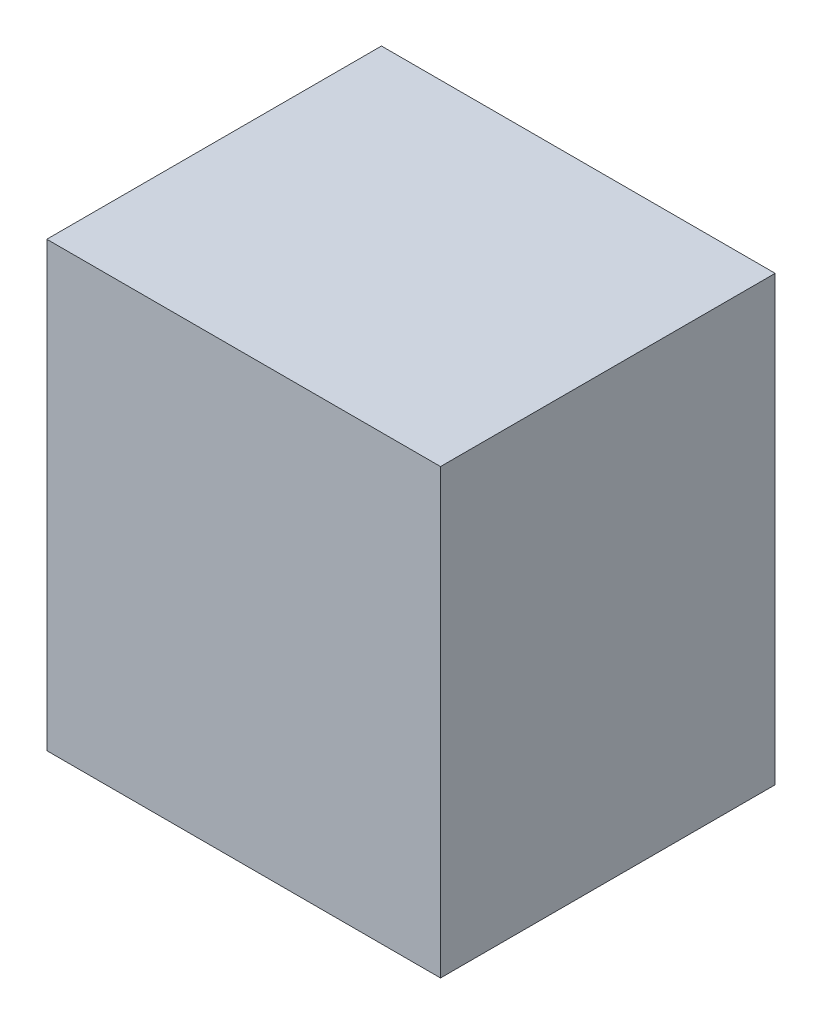
ISO-10303-21;
HEADER;
FILE_DESCRIPTION(('STEP AP214'),'2;1');
FILE_NAME('part.step','',(''),(''),'','','');
FILE_SCHEMA(('AUTOMOTIVE_DESIGN { 1 0 10303 214 1 1 1 1 }'));
ENDSEC;
DATA;
#1=APPLICATION_CONTEXT('core data for automotive mechanical design processes');
#2=APPLICATION_PROTOCOL_DEFINITION('international standard','automotive_design',2000,#1);
#3=PRODUCT_CONTEXT('',#1,'mechanical');
#4=PRODUCT('Part','Part','',(#3));
#5=PRODUCT_RELATED_PRODUCT_CATEGORY('part','',(#4));
#6=PRODUCT_DEFINITION_FORMATION('','',#4);
#7=PRODUCT_DEFINITION_CONTEXT('part definition',#1,'design');
#8=PRODUCT_DEFINITION('design','',#6,#7);
#9=PRODUCT_DEFINITION_SHAPE('','',#8);
#10=(LENGTH_UNIT() NAMED_UNIT(*) SI_UNIT(.MILLI.,.METRE.));
#11=(NAMED_UNIT(*) PLANE_ANGLE_UNIT() SI_UNIT($,.RADIAN.));
#12=(NAMED_UNIT(*) SI_UNIT($,.STERADIAN.) SOLID_ANGLE_UNIT());
#13=UNCERTAINTY_MEASURE_WITH_UNIT(LENGTH_MEASURE(1.E-05),#10,'distance_accuracy_value','');
#14=(GEOMETRIC_REPRESENTATION_CONTEXT(3) GLOBAL_UNCERTAINTY_ASSIGNED_CONTEXT((#13)) GLOBAL_UNIT_ASSIGNED_CONTEXT((#10,
#11,#12)) REPRESENTATION_CONTEXT('',''));
#15=CARTESIAN_POINT('',(0.,0.,0.));
#16=DIRECTION('',(0.,0.,1.));
#17=DIRECTION('',(1.,0.,0.));
#18=AXIS2_PLACEMENT_3D('',#15,#16,#17);
#19=CARTESIAN_POINT('',(40.,45.,68.));
#20=DIRECTION('',(-1.,0.,0.));
#21=DIRECTION('',(0.,-1.,0.));
#22=AXIS2_PLACEMENT_3D('',#19,#20,#21);
#23=PLANE('',#22);
#24=DIRECTION('',(0.,1.,0.));
#25=VECTOR('',#24,1.);
#26=CARTESIAN_POINT('',(40.,45.,0.));
#27=LINE('',#26,#25);
#28=CARTESIAN_POINT('',(40.,-45.,0.));
#29=VERTEX_POINT('',#28);
#30=CARTESIAN_POINT('',(40.,45.,0.));
#31=VERTEX_POINT('',#30);
#32=EDGE_CURVE('E107',#29,#31,#27,.T.);
#33=ORIENTED_EDGE('',*,*,#32,.T.);
#34=DIRECTION('',(0.,0.,-1.));
#35=VECTOR('',#34,1.);
#36=CARTESIAN_POINT('',(40.,45.,68.));
#37=LINE('',#36,#35);
#38=CARTESIAN_POINT('',(40.,45.,68.));
#39=VERTEX_POINT('',#38);
#40=EDGE_CURVE('E11',#39,#31,#37,.T.);
#41=ORIENTED_EDGE('',*,*,#40,.F.);
#42=DIRECTION('',(0.,1.,0.));
#43=VECTOR('',#42,1.);
#44=CARTESIAN_POINT('',(40.,45.,68.));
#45=LINE('',#44,#43);
#46=CARTESIAN_POINT('',(40.,-45.,68.));
#47=VERTEX_POINT('',#46);
#48=EDGE_CURVE('E91',#47,#39,#45,.T.);
#49=ORIENTED_EDGE('',*,*,#48,.F.);
#50=DIRECTION('',(0.,0.,-1.));
#51=VECTOR('',#50,1.);
#52=CARTESIAN_POINT('',(40.,-45.,68.));
#53=LINE('',#52,#51);
#54=EDGE_CURVE('E103',#47,#29,#53,.T.);
#55=ORIENTED_EDGE('',*,*,#54,.T.);
#56=EDGE_LOOP('',(#33,#41,#49,#55));
#57=FACE_BOUND('',#56,.T.);
#58=ADVANCED_FACE('F39',(#57),#23,.F.);
#59=CARTESIAN_POINT('',(-40.,45.,68.));
#60=DIRECTION('',(0.,-1.,0.));
#61=DIRECTION('',(0.,0.,-1.));
#62=AXIS2_PLACEMENT_3D('',#59,#60,#61);
#63=PLANE('',#62);
#64=DIRECTION('',(-1.,0.,0.));
#65=VECTOR('',#64,1.);
#66=CARTESIAN_POINT('',(-40.,45.,0.));
#67=LINE('',#66,#65);
#68=CARTESIAN_POINT('',(-40.,45.,0.));
#69=VERTEX_POINT('',#68);
#70=EDGE_CURVE('E96',#31,#69,#67,.T.);
#71=ORIENTED_EDGE('',*,*,#70,.T.);
#72=DIRECTION('',(0.,0.,-1.));
#73=VECTOR('',#72,1.);
#74=CARTESIAN_POINT('',(-40.,45.,68.));
#75=LINE('',#74,#73);
#76=CARTESIAN_POINT('',(-40.,45.,68.));
#77=VERTEX_POINT('',#76);
#78=EDGE_CURVE('E48',#77,#69,#75,.T.);
#79=ORIENTED_EDGE('',*,*,#78,.F.);
#80=DIRECTION('',(-1.,0.,0.));
#81=VECTOR('',#80,1.);
#82=CARTESIAN_POINT('',(-40.,45.,68.));
#83=LINE('',#82,#81);
#84=EDGE_CURVE('E86',#39,#77,#83,.T.);
#85=ORIENTED_EDGE('',*,*,#84,.F.);
#86=ORIENTED_EDGE('',*,*,#40,.T.);
#87=EDGE_LOOP('',(#71,#79,#85,#86));
#88=FACE_BOUND('',#87,.T.);
#89=ADVANCED_FACE('F95',(#88),#63,.F.);
#90=CARTESIAN_POINT('',(-40.,45.,68.));
#91=DIRECTION('',(1.,0.,0.));
#92=DIRECTION('',(0.,1.,0.));
#93=AXIS2_PLACEMENT_3D('',#90,#91,#92);
#94=PLANE('',#93);
#95=DIRECTION('',(0.,-1.,0.));
#96=VECTOR('',#95,1.);
#97=CARTESIAN_POINT('',(-40.,45.,0.));
#98=LINE('',#97,#96);
#99=CARTESIAN_POINT('',(-40.,-45.,0.));
#100=VERTEX_POINT('',#99);
#101=EDGE_CURVE('E73',#69,#100,#98,.T.);
#102=ORIENTED_EDGE('',*,*,#101,.T.);
#103=DIRECTION('',(0.,0.,-1.));
#104=VECTOR('',#103,1.);
#105=CARTESIAN_POINT('',(-40.,-45.,68.));
#106=LINE('',#105,#104);
#107=CARTESIAN_POINT('',(-40.,-45.,68.));
#108=VERTEX_POINT('',#107);
#109=EDGE_CURVE('E98',#108,#100,#106,.T.);
#110=ORIENTED_EDGE('',*,*,#109,.F.);
#111=DIRECTION('',(0.,-1.,0.));
#112=VECTOR('',#111,1.);
#113=CARTESIAN_POINT('',(-40.,45.,68.));
#114=LINE('',#113,#112);
#115=EDGE_CURVE('E89',#77,#108,#114,.T.);
#116=ORIENTED_EDGE('',*,*,#115,.F.);
#117=ORIENTED_EDGE('',*,*,#78,.T.);
#118=EDGE_LOOP('',(#102,#110,#116,#117));
#119=FACE_BOUND('',#118,.T.);
#120=ADVANCED_FACE('F99',(#119),#94,.F.);
#121=CARTESIAN_POINT('',(-40.,-45.,68.));
#122=DIRECTION('',(0.,1.,0.));
#123=DIRECTION('',(0.,0.,1.));
#124=AXIS2_PLACEMENT_3D('',#121,#122,#123);
#125=PLANE('',#124);
#126=DIRECTION('',(1.,0.,0.));
#127=VECTOR('',#126,1.);
#128=CARTESIAN_POINT('',(-40.,-45.,0.));
#129=LINE('',#128,#127);
#130=EDGE_CURVE('E79',#100,#29,#129,.T.);
#131=ORIENTED_EDGE('',*,*,#130,.T.);
#132=ORIENTED_EDGE('',*,*,#54,.F.);
#133=DIRECTION('',(1.,0.,0.));
#134=VECTOR('',#133,1.);
#135=CARTESIAN_POINT('',(-40.,-45.,68.));
#136=LINE('',#135,#134);
#137=EDGE_CURVE('E56',#108,#47,#136,.T.);
#138=ORIENTED_EDGE('',*,*,#137,.F.);
#139=ORIENTED_EDGE('',*,*,#109,.T.);
#140=EDGE_LOOP('',(#131,#132,#138,#139));
#141=FACE_BOUND('',#140,.T.);
#142=ADVANCED_FACE('F120',(#141),#125,.F.);
#143=CARTESIAN_POINT('',(0.,0.,68.));
#144=DIRECTION('',(0.,0.,1.));
#145=DIRECTION('',(1.,0.,0.));
#146=AXIS2_PLACEMENT_3D('',#143,#144,#145);
#147=PLANE('',#146);
#148=ORIENTED_EDGE('',*,*,#48,.T.);
#149=ORIENTED_EDGE('',*,*,#84,.T.);
#150=ORIENTED_EDGE('',*,*,#115,.T.);
#151=ORIENTED_EDGE('',*,*,#137,.T.);
#152=EDGE_LOOP('',(#148,#149,#150,#151));
#153=FACE_BOUND('',#152,.T.);
#154=ADVANCED_FACE('F87',(#153),#147,.T.);
#155=CARTESIAN_POINT('',(0.,0.,0.));
#156=DIRECTION('',(0.,0.,1.));
#157=DIRECTION('',(1.,0.,0.));
#158=AXIS2_PLACEMENT_3D('',#155,#156,#157);
#159=PLANE('',#158);
#160=ORIENTED_EDGE('',*,*,#32,.F.);
#161=ORIENTED_EDGE('',*,*,#130,.F.);
#162=ORIENTED_EDGE('',*,*,#101,.F.);
#163=ORIENTED_EDGE('',*,*,#70,.F.);
#164=EDGE_LOOP('',(#160,#161,#162,#163));
#165=FACE_BOUND('',#164,.T.);
#166=ADVANCED_FACE('F123',(#165),#159,.F.);
#167=CLOSED_SHELL('',(#58,#89,#120,#142,#154,#166));
#168=MANIFOLD_SOLID_BREP('B2',#167);
#169=ADVANCED_BREP_SHAPE_REPRESENTATION('',(#18,#168),#14);
#170=SHAPE_DEFINITION_REPRESENTATION(#9,#169);
ENDSEC;
END-ISO-10303-21;
